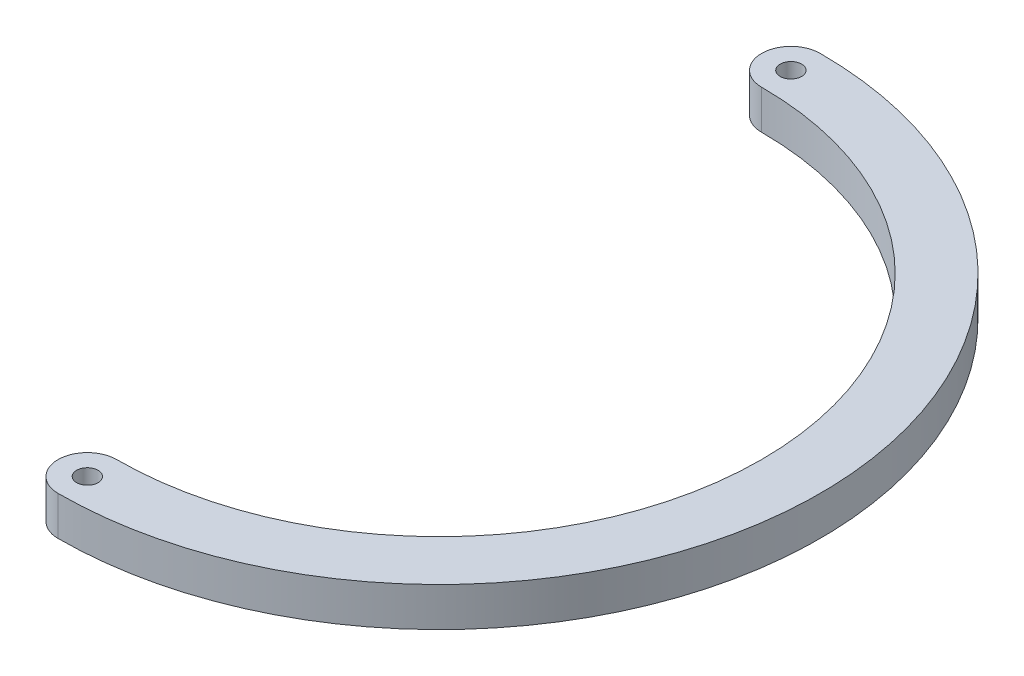
ISO-10303-21;
HEADER;
FILE_DESCRIPTION(('STEP AP214'),'2;1');
FILE_NAME('part.step','',(''),(''),'','','');
FILE_SCHEMA(('AUTOMOTIVE_DESIGN { 1 0 10303 214 1 1 1 1 }'));
ENDSEC;
DATA;
#1=APPLICATION_CONTEXT('core data for automotive mechanical design processes');
#2=APPLICATION_PROTOCOL_DEFINITION('international standard','automotive_design',2000,#1);
#3=PRODUCT_CONTEXT('',#1,'mechanical');
#4=PRODUCT('Part','Part','',(#3));
#5=PRODUCT_RELATED_PRODUCT_CATEGORY('part','',(#4));
#6=PRODUCT_DEFINITION_FORMATION('','',#4);
#7=PRODUCT_DEFINITION_CONTEXT('part definition',#1,'design');
#8=PRODUCT_DEFINITION('design','',#6,#7);
#9=PRODUCT_DEFINITION_SHAPE('','',#8);
#10=(LENGTH_UNIT() NAMED_UNIT(*) SI_UNIT(.MILLI.,.METRE.));
#11=(NAMED_UNIT(*) PLANE_ANGLE_UNIT() SI_UNIT($,.RADIAN.));
#12=(NAMED_UNIT(*) SI_UNIT($,.STERADIAN.) SOLID_ANGLE_UNIT());
#13=UNCERTAINTY_MEASURE_WITH_UNIT(LENGTH_MEASURE(1.E-05),#10,'distance_accuracy_value','');
#14=(GEOMETRIC_REPRESENTATION_CONTEXT(3) GLOBAL_UNCERTAINTY_ASSIGNED_CONTEXT((#13)) GLOBAL_UNIT_ASSIGNED_CONTEXT((#10,
#11,#12)) REPRESENTATION_CONTEXT('',''));
#15=CARTESIAN_POINT('',(0.,0.,0.));
#16=DIRECTION('',(0.,0.,1.));
#17=DIRECTION('',(1.,0.,0.));
#18=AXIS2_PLACEMENT_3D('',#15,#16,#17);
#19=CARTESIAN_POINT('',(0.,5.,0.));
#20=DIRECTION('',(0.,-1.,0.));
#21=DIRECTION('',(0.,0.,-1.));
#22=AXIS2_PLACEMENT_3D('',#19,#20,#21);
#23=CYLINDRICAL_SURFACE('',#22,97.55);
#24=CARTESIAN_POINT('',(0.,-5.,0.));
#25=DIRECTION('',(0.,1.,0.));
#26=DIRECTION('',(0.,0.,1.));
#27=AXIS2_PLACEMENT_3D('',#24,#25,#26);
#28=CIRCLE('',#27,97.55);
#29=CARTESIAN_POINT('',(0.,-5.,-97.55));
#30=VERTEX_POINT('',#29);
#31=CARTESIAN_POINT('',(0.,-5.,97.55));
#32=VERTEX_POINT('',#31);
#33=EDGE_CURVE('E98',#30,#32,#28,.F.);
#34=ORIENTED_EDGE('',*,*,#33,.F.);
#35=DIRECTION('',(0.,-1.,0.));
#36=VECTOR('',#35,1.);
#37=CARTESIAN_POINT('',(0.,5.,-97.55));
#38=LINE('',#37,#36);
#39=CARTESIAN_POINT('',(0.,5.,-97.55));
#40=VERTEX_POINT('',#39);
#41=EDGE_CURVE('E11',#40,#30,#38,.T.);
#42=ORIENTED_EDGE('',*,*,#41,.F.);
#43=CARTESIAN_POINT('',(0.,5.,0.));
#44=DIRECTION('',(0.,1.,0.));
#45=DIRECTION('',(0.,0.,1.));
#46=AXIS2_PLACEMENT_3D('',#43,#44,#45);
#47=CIRCLE('',#46,97.55);
#48=CARTESIAN_POINT('',(0.,5.,97.55));
#49=VERTEX_POINT('',#48);
#50=EDGE_CURVE('E83',#40,#49,#47,.F.);
#51=ORIENTED_EDGE('',*,*,#50,.T.);
#52=DIRECTION('',(0.,-1.,0.));
#53=VECTOR('',#52,1.);
#54=CARTESIAN_POINT('',(0.,5.,97.55));
#55=LINE('',#54,#53);
#56=EDGE_CURVE('E73',#49,#32,#55,.T.);
#57=ORIENTED_EDGE('',*,*,#56,.T.);
#58=EDGE_LOOP('',(#34,#42,#51,#57));
#59=FACE_BOUND('',#58,.T.);
#60=ADVANCED_FACE('F35',(#59),#23,.T.);
#61=CARTESIAN_POINT('',(0.,5.,-90.05));
#62=DIRECTION('',(0.,-1.,0.));
#63=DIRECTION('',(0.,0.,-1.));
#64=AXIS2_PLACEMENT_3D('',#61,#62,#63);
#65=CYLINDRICAL_SURFACE('',#64,7.5);
#66=CARTESIAN_POINT('',(0.,-5.,-90.05));
#67=DIRECTION('',(0.,1.,0.));
#68=DIRECTION('',(0.,0.,1.));
#69=AXIS2_PLACEMENT_3D('',#66,#67,#68);
#70=CIRCLE('',#69,7.5);
#71=CARTESIAN_POINT('',(0.,-5.,-82.55));
#72=VERTEX_POINT('',#71);
#73=EDGE_CURVE('E89',#30,#72,#70,.T.);
#74=ORIENTED_EDGE('',*,*,#73,.T.);
#75=DIRECTION('',(0.,-1.,0.));
#76=VECTOR('',#75,1.);
#77=CARTESIAN_POINT('',(0.,5.,-82.55));
#78=LINE('',#77,#76);
#79=CARTESIAN_POINT('',(0.,5.,-82.55));
#80=VERTEX_POINT('',#79);
#81=EDGE_CURVE('E43',#80,#72,#78,.T.);
#82=ORIENTED_EDGE('',*,*,#81,.F.);
#83=CARTESIAN_POINT('',(0.,5.,-90.05));
#84=DIRECTION('',(0.,1.,0.));
#85=DIRECTION('',(0.,0.,1.));
#86=AXIS2_PLACEMENT_3D('',#83,#84,#85);
#87=CIRCLE('',#86,7.5);
#88=EDGE_CURVE('E78',#40,#80,#87,.T.);
#89=ORIENTED_EDGE('',*,*,#88,.F.);
#90=ORIENTED_EDGE('',*,*,#41,.T.);
#91=EDGE_LOOP('',(#74,#82,#89,#90));
#92=FACE_BOUND('',#91,.T.);
#93=ADVANCED_FACE('F87',(#92),#65,.T.);
#94=CARTESIAN_POINT('',(0.,5.,0.));
#95=DIRECTION('',(0.,-1.,0.));
#96=DIRECTION('',(0.,0.,-1.));
#97=AXIS2_PLACEMENT_3D('',#94,#95,#96);
#98=CYLINDRICAL_SURFACE('',#97,82.55);
#99=CARTESIAN_POINT('',(0.,-5.,0.));
#100=DIRECTION('',(0.,1.,0.));
#101=DIRECTION('',(0.,0.,1.));
#102=AXIS2_PLACEMENT_3D('',#99,#100,#101);
#103=CIRCLE('',#102,82.55);
#104=CARTESIAN_POINT('',(0.,-5.,82.55));
#105=VERTEX_POINT('',#104);
#106=EDGE_CURVE('E103',#105,#72,#103,.T.);
#107=ORIENTED_EDGE('',*,*,#106,.F.);
#108=DIRECTION('',(0.,-1.,0.));
#109=VECTOR('',#108,1.);
#110=CARTESIAN_POINT('',(0.,5.,82.55));
#111=LINE('',#110,#109);
#112=CARTESIAN_POINT('',(0.,5.,82.55));
#113=VERTEX_POINT('',#112);
#114=EDGE_CURVE('E66',#113,#105,#111,.T.);
#115=ORIENTED_EDGE('',*,*,#114,.F.);
#116=CARTESIAN_POINT('',(0.,5.,0.));
#117=DIRECTION('',(0.,1.,0.));
#118=DIRECTION('',(0.,0.,1.));
#119=AXIS2_PLACEMENT_3D('',#116,#117,#118);
#120=CIRCLE('',#119,82.55);
#121=EDGE_CURVE('E82',#113,#80,#120,.T.);
#122=ORIENTED_EDGE('',*,*,#121,.T.);
#123=ORIENTED_EDGE('',*,*,#81,.T.);
#124=EDGE_LOOP('',(#107,#115,#122,#123));
#125=FACE_BOUND('',#124,.T.);
#126=ADVANCED_FACE('F93',(#125),#98,.F.);
#127=CARTESIAN_POINT('',(0.,5.,90.05));
#128=DIRECTION('',(0.,-1.,0.));
#129=DIRECTION('',(0.,0.,-1.));
#130=AXIS2_PLACEMENT_3D('',#127,#128,#129);
#131=CYLINDRICAL_SURFACE('',#130,7.5);
#132=CARTESIAN_POINT('',(0.,-5.,90.05));
#133=DIRECTION('',(0.,1.,0.));
#134=DIRECTION('',(0.,0.,1.));
#135=AXIS2_PLACEMENT_3D('',#132,#133,#134);
#136=CIRCLE('',#135,7.5);
#137=EDGE_CURVE('E105',#105,#32,#136,.T.);
#138=ORIENTED_EDGE('',*,*,#137,.T.);
#139=ORIENTED_EDGE('',*,*,#56,.F.);
#140=CARTESIAN_POINT('',(0.,5.,90.05));
#141=DIRECTION('',(0.,1.,0.));
#142=DIRECTION('',(0.,0.,1.));
#143=AXIS2_PLACEMENT_3D('',#140,#141,#142);
#144=CIRCLE('',#143,7.5);
#145=EDGE_CURVE('E51',#113,#49,#144,.T.);
#146=ORIENTED_EDGE('',*,*,#145,.F.);
#147=ORIENTED_EDGE('',*,*,#114,.T.);
#148=EDGE_LOOP('',(#138,#139,#146,#147));
#149=FACE_BOUND('',#148,.T.);
#150=ADVANCED_FACE('F126',(#149),#131,.T.);
#151=CARTESIAN_POINT('',(0.,5.,0.));
#152=DIRECTION('',(0.,1.,0.));
#153=DIRECTION('',(0.,0.,1.));
#154=AXIS2_PLACEMENT_3D('',#151,#152,#153);
#155=PLANE('',#154);
#156=CARTESIAN_POINT('',(0.,5.,-90.05));
#157=DIRECTION('',(0.,1.,0.));
#158=DIRECTION('',(0.,0.,1.));
#159=AXIS2_PLACEMENT_3D('',#156,#157,#158);
#160=CIRCLE('',#159,2.74999999999999);
#161=CARTESIAN_POINT('',(0.,5.,-87.3));
#162=VERTEX_POINT('',#161);
#163=EDGE_CURVE('E117',#162,#162,#160,.T.);
#164=ORIENTED_EDGE('',*,*,#163,.F.);
#165=EDGE_LOOP('',(#164));
#166=FACE_BOUND('',#165,.T.);
#167=CARTESIAN_POINT('',(0.,5.,90.05));
#168=DIRECTION('',(0.,1.,0.));
#169=DIRECTION('',(0.,0.,1.));
#170=AXIS2_PLACEMENT_3D('',#167,#168,#169);
#171=CIRCLE('',#170,2.74999999999999);
#172=CARTESIAN_POINT('',(0.,5.,92.8));
#173=VERTEX_POINT('',#172);
#174=EDGE_CURVE('E111',#173,#173,#171,.T.);
#175=ORIENTED_EDGE('',*,*,#174,.F.);
#176=EDGE_LOOP('',(#175));
#177=FACE_BOUND('',#176,.T.);
#178=ORIENTED_EDGE('',*,*,#50,.F.);
#179=ORIENTED_EDGE('',*,*,#88,.T.);
#180=ORIENTED_EDGE('',*,*,#121,.F.);
#181=ORIENTED_EDGE('',*,*,#145,.T.);
#182=EDGE_LOOP('',(#178,#179,#180,#181));
#183=FACE_BOUND('',#182,.T.);
#184=ADVANCED_FACE('F80',(#166,#177,#183),#155,.T.);
#185=CARTESIAN_POINT('',(0.,-5.,0.));
#186=DIRECTION('',(0.,1.,0.));
#187=DIRECTION('',(0.,0.,1.));
#188=AXIS2_PLACEMENT_3D('',#185,#186,#187);
#189=PLANE('',#188);
#190=CARTESIAN_POINT('',(0.,-5.,-90.05));
#191=DIRECTION('',(0.,1.,0.));
#192=DIRECTION('',(0.,0.,1.));
#193=AXIS2_PLACEMENT_3D('',#190,#191,#192);
#194=CIRCLE('',#193,2.75);
#195=CARTESIAN_POINT('',(0.,-5.,-87.3));
#196=VERTEX_POINT('',#195);
#197=EDGE_CURVE('E114',#196,#196,#194,.T.);
#198=ORIENTED_EDGE('',*,*,#197,.T.);
#199=EDGE_LOOP('',(#198));
#200=FACE_BOUND('',#199,.T.);
#201=CARTESIAN_POINT('',(0.,-5.,90.05));
#202=DIRECTION('',(0.,1.,0.));
#203=DIRECTION('',(0.,0.,1.));
#204=AXIS2_PLACEMENT_3D('',#201,#202,#203);
#205=CIRCLE('',#204,2.75);
#206=CARTESIAN_POINT('',(0.,-5.,92.8));
#207=VERTEX_POINT('',#206);
#208=EDGE_CURVE('E101',#207,#207,#205,.T.);
#209=ORIENTED_EDGE('',*,*,#208,.T.);
#210=EDGE_LOOP('',(#209));
#211=FACE_BOUND('',#210,.T.);
#212=ORIENTED_EDGE('',*,*,#33,.T.);
#213=ORIENTED_EDGE('',*,*,#137,.F.);
#214=ORIENTED_EDGE('',*,*,#106,.T.);
#215=ORIENTED_EDGE('',*,*,#73,.F.);
#216=EDGE_LOOP('',(#212,#213,#214,#215));
#217=FACE_BOUND('',#216,.T.);
#218=ADVANCED_FACE('F125',(#200,#211,#217),#189,.F.);
#219=CARTESIAN_POINT('',(0.,5.,90.05));
#220=DIRECTION('',(0.,1.,0.));
#221=DIRECTION('',(0.,0.,1.));
#222=AXIS2_PLACEMENT_3D('',#219,#220,#221);
#223=CYLINDRICAL_SURFACE('',#222,2.74999999999999);
#224=ORIENTED_EDGE('',*,*,#208,.F.);
#225=EDGE_LOOP('',(#224));
#226=FACE_BOUND('',#225,.T.);
#227=ORIENTED_EDGE('',*,*,#174,.T.);
#228=EDGE_LOOP('',(#227));
#229=FACE_BOUND('',#228,.T.);
#230=ADVANCED_FACE('F130',(#226,#229),#223,.F.);
#231=CARTESIAN_POINT('',(0.,5.,-90.05));
#232=DIRECTION('',(0.,1.,0.));
#233=DIRECTION('',(0.,0.,1.));
#234=AXIS2_PLACEMENT_3D('',#231,#232,#233);
#235=CYLINDRICAL_SURFACE('',#234,2.74999999999999);
#236=ORIENTED_EDGE('',*,*,#197,.F.);
#237=EDGE_LOOP('',(#236));
#238=FACE_BOUND('',#237,.T.);
#239=ORIENTED_EDGE('',*,*,#163,.T.);
#240=EDGE_LOOP('',(#239));
#241=FACE_BOUND('',#240,.T.);
#242=ADVANCED_FACE('F121',(#238,#241),#235,.F.);
#243=CLOSED_SHELL('',(#60,#93,#126,#150,#184,#218,#230,#242));
#244=MANIFOLD_SOLID_BREP('B2',#243);
#245=ADVANCED_BREP_SHAPE_REPRESENTATION('',(#18,#244),#14);
#246=SHAPE_DEFINITION_REPRESENTATION(#9,#245);
ENDSEC;
END-ISO-10303-21;
